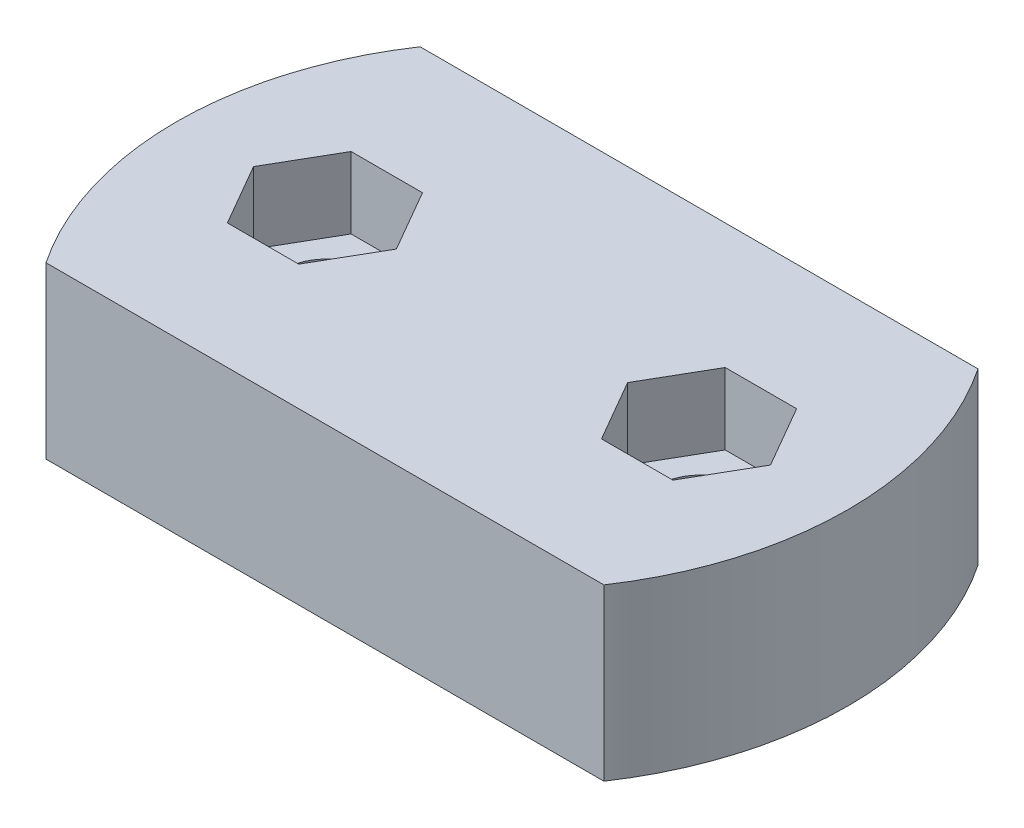
ISO-10303-21;
HEADER;
FILE_DESCRIPTION(('STEP AP214'),'2;1');
FILE_NAME('part.step','',(''),(''),'','','');
FILE_SCHEMA(('AUTOMOTIVE_DESIGN { 1 0 10303 214 1 1 1 1 }'));
ENDSEC;
DATA;
#1=APPLICATION_CONTEXT('core data for automotive mechanical design processes');
#2=APPLICATION_PROTOCOL_DEFINITION('international standard','automotive_design',2000,#1);
#3=PRODUCT_CONTEXT('',#1,'mechanical');
#4=PRODUCT('Part','Part','',(#3));
#5=PRODUCT_RELATED_PRODUCT_CATEGORY('part','',(#4));
#6=PRODUCT_DEFINITION_FORMATION('','',#4);
#7=PRODUCT_DEFINITION_CONTEXT('part definition',#1,'design');
#8=PRODUCT_DEFINITION('design','',#6,#7);
#9=PRODUCT_DEFINITION_SHAPE('','',#8);
#10=(LENGTH_UNIT() NAMED_UNIT(*) SI_UNIT(.MILLI.,.METRE.));
#11=(NAMED_UNIT(*) PLANE_ANGLE_UNIT() SI_UNIT($,.RADIAN.));
#12=(NAMED_UNIT(*) SI_UNIT($,.STERADIAN.) SOLID_ANGLE_UNIT());
#13=UNCERTAINTY_MEASURE_WITH_UNIT(LENGTH_MEASURE(1.E-05),#10,'distance_accuracy_value','');
#14=(GEOMETRIC_REPRESENTATION_CONTEXT(3) GLOBAL_UNCERTAINTY_ASSIGNED_CONTEXT((#13)) GLOBAL_UNIT_ASSIGNED_CONTEXT((#10,
#11,#12)) REPRESENTATION_CONTEXT('',''));
#15=CARTESIAN_POINT('',(0.,0.,0.));
#16=DIRECTION('',(0.,0.,1.));
#17=DIRECTION('',(1.,0.,0.));
#18=AXIS2_PLACEMENT_3D('',#15,#16,#17);
#19=CARTESIAN_POINT('',(0.,5.,0.));
#20=DIRECTION('',(0.,-1.,0.));
#21=DIRECTION('',(0.,0.,-1.));
#22=AXIS2_PLACEMENT_3D('',#19,#20,#21);
#23=CYLINDRICAL_SURFACE('',#22,19.75);
#24=CARTESIAN_POINT('',(0.,5.,0.));
#25=DIRECTION('',(0.,1.,0.));
#26=DIRECTION('',(0.,0.,1.));
#27=AXIS2_PLACEMENT_3D('',#24,#25,#26);
#28=CIRCLE('',#27,19.75);
#29=CARTESIAN_POINT('',(-16.4031247023242,5.,-11.));
#30=VERTEX_POINT('',#29);
#31=CARTESIAN_POINT('',(-16.4031247023242,5.,11.));
#32=VERTEX_POINT('',#31);
#33=EDGE_CURVE('E40',#30,#32,#28,.T.);
#34=ORIENTED_EDGE('',*,*,#33,.F.);
#35=DIRECTION('',(0.,1.,0.));
#36=VECTOR('',#35,1.);
#37=CARTESIAN_POINT('',(-16.4031247023242,-5.,-11.));
#38=LINE('',#37,#36);
#39=CARTESIAN_POINT('',(-16.4031247023242,-5.,-11.));
#40=VERTEX_POINT('',#39);
#41=EDGE_CURVE('E145',#40,#30,#38,.T.);
#42=ORIENTED_EDGE('',*,*,#41,.F.);
#43=CARTESIAN_POINT('',(0.,-5.,0.));
#44=DIRECTION('',(0.,1.,0.));
#45=DIRECTION('',(0.,0.,1.));
#46=AXIS2_PLACEMENT_3D('',#43,#44,#45);
#47=CIRCLE('',#46,19.75);
#48=CARTESIAN_POINT('',(-16.4031247023242,-5.,11.));
#49=VERTEX_POINT('',#48);
#50=EDGE_CURVE('E156',#40,#49,#47,.T.);
#51=ORIENTED_EDGE('',*,*,#50,.T.);
#52=DIRECTION('',(0.,1.,0.));
#53=VECTOR('',#52,1.);
#54=CARTESIAN_POINT('',(-16.4031247023242,-5.,11.));
#55=LINE('',#54,#53);
#56=EDGE_CURVE('E47',#49,#32,#55,.T.);
#57=ORIENTED_EDGE('',*,*,#56,.T.);
#58=EDGE_LOOP('',(#34,#42,#51,#57));
#59=FACE_BOUND('',#58,.T.);
#60=ADVANCED_FACE('F32',(#59),#23,.T.);
#61=CARTESIAN_POINT('',(16.4031247023242,-5.,11.));
#62=VERTEX_POINT('',#61);
#63=CARTESIAN_POINT('',(16.4031247023242,-5.,-11.));
#64=VERTEX_POINT('',#63);
#65=EDGE_CURVE('E35',#62,#64,#47,.T.);
#66=ORIENTED_EDGE('',*,*,#65,.T.);
#67=DIRECTION('',(0.,1.,0.));
#68=VECTOR('',#67,1.);
#69=CARTESIAN_POINT('',(16.4031247023242,-5.,-11.));
#70=LINE('',#69,#68);
#71=CARTESIAN_POINT('',(16.4031247023242,5.,-11.));
#72=VERTEX_POINT('',#71);
#73=EDGE_CURVE('E55',#64,#72,#70,.T.);
#74=ORIENTED_EDGE('',*,*,#73,.T.);
#75=CARTESIAN_POINT('',(16.4031247023242,5.,11.));
#76=VERTEX_POINT('',#75);
#77=EDGE_CURVE('E11',#76,#72,#28,.T.);
#78=ORIENTED_EDGE('',*,*,#77,.F.);
#79=DIRECTION('',(0.,1.,0.));
#80=VECTOR('',#79,1.);
#81=CARTESIAN_POINT('',(16.4031247023242,-5.,11.));
#82=LINE('',#81,#80);
#83=EDGE_CURVE('E281',#62,#76,#82,.T.);
#84=ORIENTED_EDGE('',*,*,#83,.F.);
#85=EDGE_LOOP('',(#66,#74,#78,#84));
#86=FACE_BOUND('',#85,.T.);
#87=ADVANCED_FACE('F268',(#86),#23,.T.);
#88=CARTESIAN_POINT('',(0.,5.,0.));
#89=DIRECTION('',(0.,1.,0.));
#90=DIRECTION('',(0.,0.,1.));
#91=AXIS2_PLACEMENT_3D('',#88,#89,#90);
#92=PLANE('',#91);
#93=DIRECTION('',(1.,0.,0.));
#94=VECTOR('',#93,1.);
#95=CARTESIAN_POINT('',(0.,5.,-11.));
#96=LINE('',#95,#94);
#97=EDGE_CURVE('E151',#30,#72,#96,.T.);
#98=ORIENTED_EDGE('',*,*,#97,.F.);
#99=ORIENTED_EDGE('',*,*,#33,.T.);
#100=DIRECTION('',(1.,0.,0.));
#101=VECTOR('',#100,1.);
#102=CARTESIAN_POINT('',(0.,5.,11.));
#103=LINE('',#102,#101);
#104=EDGE_CURVE('E287',#32,#76,#103,.T.);
#105=ORIENTED_EDGE('',*,*,#104,.T.);
#106=ORIENTED_EDGE('',*,*,#77,.T.);
#107=EDGE_LOOP('',(#98,#99,#105,#106));
#108=FACE_BOUND('',#107,.T.);
#109=DIRECTION('',(1.,0.,0.));
#110=VECTOR('',#109,1.);
#111=CARTESIAN_POINT('',(-13.1,5.,3.63730669589464));
#112=LINE('',#111,#110);
#113=CARTESIAN_POINT('',(-13.1,5.,3.63730669589464));
#114=VERTEX_POINT('',#113);
#115=CARTESIAN_POINT('',(-8.9,5.,3.63730669589464));
#116=VERTEX_POINT('',#115);
#117=EDGE_CURVE('E221',#114,#116,#112,.T.);
#118=ORIENTED_EDGE('',*,*,#117,.F.);
#119=DIRECTION('',(0.5,0.,0.866025403784438));
#120=VECTOR('',#119,1.);
#121=CARTESIAN_POINT('',(-15.2,5.,0.));
#122=LINE('',#121,#120);
#123=CARTESIAN_POINT('',(-15.2,5.,0.));
#124=VERTEX_POINT('',#123);
#125=EDGE_CURVE('E170',#124,#114,#122,.T.);
#126=ORIENTED_EDGE('',*,*,#125,.F.);
#127=DIRECTION('',(-0.5,0.,0.866025403784439));
#128=VECTOR('',#127,1.);
#129=CARTESIAN_POINT('',(-13.1,5.,-3.63730669589464));
#130=LINE('',#129,#128);
#131=CARTESIAN_POINT('',(-13.1,5.,-3.63730669589464));
#132=VERTEX_POINT('',#131);
#133=EDGE_CURVE('E327',#132,#124,#130,.T.);
#134=ORIENTED_EDGE('',*,*,#133,.F.);
#135=DIRECTION('',(-1.,0.,0.));
#136=VECTOR('',#135,1.);
#137=CARTESIAN_POINT('',(-8.9,5.,-3.63730669589464));
#138=LINE('',#137,#136);
#139=CARTESIAN_POINT('',(-8.9,5.,-3.63730669589464));
#140=VERTEX_POINT('',#139);
#141=EDGE_CURVE('E325',#140,#132,#138,.T.);
#142=ORIENTED_EDGE('',*,*,#141,.F.);
#143=DIRECTION('',(-0.5,0.,-0.866025403784438));
#144=VECTOR('',#143,1.);
#145=CARTESIAN_POINT('',(-6.8,5.,0.));
#146=LINE('',#145,#144);
#147=CARTESIAN_POINT('',(-6.8,5.,0.));
#148=VERTEX_POINT('',#147);
#149=EDGE_CURVE('E322',#148,#140,#146,.T.);
#150=ORIENTED_EDGE('',*,*,#149,.F.);
#151=DIRECTION('',(0.5,0.,-0.866025403784439));
#152=VECTOR('',#151,1.);
#153=CARTESIAN_POINT('',(-8.9,5.,3.63730669589464));
#154=LINE('',#153,#152);
#155=EDGE_CURVE('E319',#116,#148,#154,.T.);
#156=ORIENTED_EDGE('',*,*,#155,.F.);
#157=EDGE_LOOP('',(#118,#126,#134,#142,#150,#156));
#158=FACE_BOUND('',#157,.T.);
#159=DIRECTION('',(0.5,0.,-0.866025403784438));
#160=VECTOR('',#159,1.);
#161=CARTESIAN_POINT('',(15.2,5.,0.));
#162=LINE('',#161,#160);
#163=CARTESIAN_POINT('',(13.1,5.,3.63730669589464));
#164=VERTEX_POINT('',#163);
#165=CARTESIAN_POINT('',(15.2,5.,0.));
#166=VERTEX_POINT('',#165);
#167=EDGE_CURVE('E202',#164,#166,#162,.T.);
#168=ORIENTED_EDGE('',*,*,#167,.F.);
#169=DIRECTION('',(1.,0.,0.));
#170=VECTOR('',#169,1.);
#171=CARTESIAN_POINT('',(13.1,5.,3.63730669589464));
#172=LINE('',#171,#170);
#173=CARTESIAN_POINT('',(8.9,5.,3.63730669589464));
#174=VERTEX_POINT('',#173);
#175=EDGE_CURVE('E186',#174,#164,#172,.T.);
#176=ORIENTED_EDGE('',*,*,#175,.F.);
#177=DIRECTION('',(0.5,0.,0.866025403784439));
#178=VECTOR('',#177,1.);
#179=CARTESIAN_POINT('',(8.9,5.,3.63730669589464));
#180=LINE('',#179,#178);
#181=CARTESIAN_POINT('',(6.8,5.,0.));
#182=VERTEX_POINT('',#181);
#183=EDGE_CURVE('E214',#182,#174,#180,.T.);
#184=ORIENTED_EDGE('',*,*,#183,.F.);
#185=DIRECTION('',(-0.5,0.,0.866025403784438));
#186=VECTOR('',#185,1.);
#187=CARTESIAN_POINT('',(6.8,5.,0.));
#188=LINE('',#187,#186);
#189=CARTESIAN_POINT('',(8.9,5.,-3.63730669589464));
#190=VERTEX_POINT('',#189);
#191=EDGE_CURVE('E211',#190,#182,#188,.T.);
#192=ORIENTED_EDGE('',*,*,#191,.F.);
#193=DIRECTION('',(-1.,0.,0.));
#194=VECTOR('',#193,1.);
#195=CARTESIAN_POINT('',(8.9,5.,-3.63730669589464));
#196=LINE('',#195,#194);
#197=CARTESIAN_POINT('',(13.1,5.,-3.63730669589464));
#198=VERTEX_POINT('',#197);
#199=EDGE_CURVE('E208',#198,#190,#196,.T.);
#200=ORIENTED_EDGE('',*,*,#199,.F.);
#201=DIRECTION('',(-0.5,0.,-0.866025403784439));
#202=VECTOR('',#201,1.);
#203=CARTESIAN_POINT('',(13.1,5.,-3.63730669589464));
#204=LINE('',#203,#202);
#205=EDGE_CURVE('E204',#166,#198,#204,.T.);
#206=ORIENTED_EDGE('',*,*,#205,.F.);
#207=EDGE_LOOP('',(#168,#176,#184,#192,#200,#206));
#208=FACE_BOUND('',#207,.T.);
#209=ADVANCED_FACE('F240',(#108,#158,#208),#92,.T.);
#210=CARTESIAN_POINT('',(0.,-5.,0.));
#211=DIRECTION('',(0.,1.,0.));
#212=DIRECTION('',(0.,0.,1.));
#213=AXIS2_PLACEMENT_3D('',#210,#211,#212);
#214=PLANE('',#213);
#215=CARTESIAN_POINT('',(11.,-5.,0.));
#216=DIRECTION('',(0.,1.,0.));
#217=DIRECTION('',(0.,0.,1.));
#218=AXIS2_PLACEMENT_3D('',#215,#216,#217);
#219=CIRCLE('',#218,2.2479);
#220=CARTESIAN_POINT('',(11.,-5.,2.2479));
#221=VERTEX_POINT('',#220);
#222=EDGE_CURVE('E205',#221,#221,#219,.T.);
#223=ORIENTED_EDGE('',*,*,#222,.T.);
#224=EDGE_LOOP('',(#223));
#225=FACE_BOUND('',#224,.T.);
#226=CARTESIAN_POINT('',(-11.,-5.,0.));
#227=DIRECTION('',(0.,1.,0.));
#228=DIRECTION('',(0.,0.,1.));
#229=AXIS2_PLACEMENT_3D('',#226,#227,#228);
#230=CIRCLE('',#229,2.2479);
#231=CARTESIAN_POINT('',(-11.,-5.,2.2479));
#232=VERTEX_POINT('',#231);
#233=EDGE_CURVE('E293',#232,#232,#230,.T.);
#234=ORIENTED_EDGE('',*,*,#233,.T.);
#235=EDGE_LOOP('',(#234));
#236=FACE_BOUND('',#235,.T.);
#237=ORIENTED_EDGE('',*,*,#50,.F.);
#238=DIRECTION('',(1.,0.,0.));
#239=VECTOR('',#238,1.);
#240=CARTESIAN_POINT('',(0.,-5.,-11.));
#241=LINE('',#240,#239);
#242=EDGE_CURVE('E142',#40,#64,#241,.T.);
#243=ORIENTED_EDGE('',*,*,#242,.T.);
#244=ORIENTED_EDGE('',*,*,#65,.F.);
#245=DIRECTION('',(1.,0.,0.));
#246=VECTOR('',#245,1.);
#247=CARTESIAN_POINT('',(0.,-5.,11.));
#248=LINE('',#247,#246);
#249=EDGE_CURVE('E160',#49,#62,#248,.T.);
#250=ORIENTED_EDGE('',*,*,#249,.F.);
#251=EDGE_LOOP('',(#237,#243,#244,#250));
#252=FACE_BOUND('',#251,.T.);
#253=ADVANCED_FACE('F159',(#225,#236,#252),#214,.F.);
#254=CARTESIAN_POINT('',(15.2,0.799999999999999,0.));
#255=DIRECTION('',(0.866025403784438,0.,0.5));
#256=DIRECTION('',(0.5,0.,-0.866025403784438));
#257=AXIS2_PLACEMENT_3D('',#254,#255,#256);
#258=PLANE('',#257);
#259=ORIENTED_EDGE('',*,*,#167,.T.);
#260=DIRECTION('',(0.,1.,0.));
#261=VECTOR('',#260,1.);
#262=CARTESIAN_POINT('',(15.2,0.799999999999999,0.));
#263=LINE('',#262,#261);
#264=CARTESIAN_POINT('',(15.2,0.799999999999999,0.));
#265=VERTEX_POINT('',#264);
#266=EDGE_CURVE('E201',#265,#166,#263,.T.);
#267=ORIENTED_EDGE('',*,*,#266,.F.);
#268=DIRECTION('',(0.5,0.,-0.866025403784438));
#269=VECTOR('',#268,1.);
#270=CARTESIAN_POINT('',(15.2,0.799999999999999,0.));
#271=LINE('',#270,#269);
#272=CARTESIAN_POINT('',(13.1,0.799999999999999,3.63730669589464));
#273=VERTEX_POINT('',#272);
#274=EDGE_CURVE('E182',#273,#265,#271,.T.);
#275=ORIENTED_EDGE('',*,*,#274,.F.);
#276=DIRECTION('',(0.,1.,0.));
#277=VECTOR('',#276,1.);
#278=CARTESIAN_POINT('',(13.1,0.799999999999999,3.63730669589464));
#279=LINE('',#278,#277);
#280=EDGE_CURVE('E219',#273,#164,#279,.T.);
#281=ORIENTED_EDGE('',*,*,#280,.T.);
#282=EDGE_LOOP('',(#259,#267,#275,#281));
#283=FACE_BOUND('',#282,.T.);
#284=ADVANCED_FACE('F251',(#283),#258,.F.);
#285=CARTESIAN_POINT('',(13.1,0.799999999999999,3.63730669589464));
#286=DIRECTION('',(0.,0.,1.));
#287=DIRECTION('',(1.,0.,0.));
#288=AXIS2_PLACEMENT_3D('',#285,#286,#287);
#289=PLANE('',#288);
#290=ORIENTED_EDGE('',*,*,#175,.T.);
#291=ORIENTED_EDGE('',*,*,#280,.F.);
#292=DIRECTION('',(1.,0.,0.));
#293=VECTOR('',#292,1.);
#294=CARTESIAN_POINT('',(13.1,0.799999999999999,3.63730669589464));
#295=LINE('',#294,#293);
#296=CARTESIAN_POINT('',(8.9,0.799999999999999,3.63730669589464));
#297=VERTEX_POINT('',#296);
#298=EDGE_CURVE('E198',#297,#273,#295,.T.);
#299=ORIENTED_EDGE('',*,*,#298,.F.);
#300=DIRECTION('',(0.,1.,0.));
#301=VECTOR('',#300,1.);
#302=CARTESIAN_POINT('',(8.9,0.799999999999999,3.63730669589464));
#303=LINE('',#302,#301);
#304=EDGE_CURVE('E222',#297,#174,#303,.T.);
#305=ORIENTED_EDGE('',*,*,#304,.T.);
#306=EDGE_LOOP('',(#290,#291,#299,#305));
#307=FACE_BOUND('',#306,.T.);
#308=ADVANCED_FACE('F253',(#307),#289,.F.);
#309=CARTESIAN_POINT('',(8.9,0.799999999999999,3.63730669589464));
#310=DIRECTION('',(-0.866025403784439,0.,0.5));
#311=DIRECTION('',(0.5,0.,0.866025403784439));
#312=AXIS2_PLACEMENT_3D('',#309,#310,#311);
#313=PLANE('',#312);
#314=ORIENTED_EDGE('',*,*,#183,.T.);
#315=ORIENTED_EDGE('',*,*,#304,.F.);
#316=DIRECTION('',(0.5,0.,0.866025403784439));
#317=VECTOR('',#316,1.);
#318=CARTESIAN_POINT('',(8.9,0.799999999999999,3.63730669589464));
#319=LINE('',#318,#317);
#320=CARTESIAN_POINT('',(6.8,0.799999999999999,0.));
#321=VERTEX_POINT('',#320);
#322=EDGE_CURVE('E195',#321,#297,#319,.T.);
#323=ORIENTED_EDGE('',*,*,#322,.F.);
#324=DIRECTION('',(0.,1.,0.));
#325=VECTOR('',#324,1.);
#326=CARTESIAN_POINT('',(6.8,0.799999999999999,0.));
#327=LINE('',#326,#325);
#328=EDGE_CURVE('E224',#321,#182,#327,.T.);
#329=ORIENTED_EDGE('',*,*,#328,.T.);
#330=EDGE_LOOP('',(#314,#315,#323,#329));
#331=FACE_BOUND('',#330,.T.);
#332=ADVANCED_FACE('F255',(#331),#313,.F.);
#333=CARTESIAN_POINT('',(6.8,0.799999999999999,0.));
#334=DIRECTION('',(-0.866025403784439,0.,-0.5));
#335=DIRECTION('',(-0.5,0.,0.866025403784439));
#336=AXIS2_PLACEMENT_3D('',#333,#334,#335);
#337=PLANE('',#336);
#338=ORIENTED_EDGE('',*,*,#191,.T.);
#339=ORIENTED_EDGE('',*,*,#328,.F.);
#340=DIRECTION('',(-0.5,0.,0.866025403784438));
#341=VECTOR('',#340,1.);
#342=CARTESIAN_POINT('',(6.8,0.799999999999999,0.));
#343=LINE('',#342,#341);
#344=CARTESIAN_POINT('',(8.9,0.799999999999999,-3.63730669589464));
#345=VERTEX_POINT('',#344);
#346=EDGE_CURVE('E192',#345,#321,#343,.T.);
#347=ORIENTED_EDGE('',*,*,#346,.F.);
#348=DIRECTION('',(0.,1.,0.));
#349=VECTOR('',#348,1.);
#350=CARTESIAN_POINT('',(8.9,0.799999999999999,-3.63730669589464));
#351=LINE('',#350,#349);
#352=EDGE_CURVE('E226',#345,#190,#351,.T.);
#353=ORIENTED_EDGE('',*,*,#352,.T.);
#354=EDGE_LOOP('',(#338,#339,#347,#353));
#355=FACE_BOUND('',#354,.T.);
#356=ADVANCED_FACE('F258',(#355),#337,.F.);
#357=CARTESIAN_POINT('',(8.9,0.799999999999999,-3.63730669589464));
#358=DIRECTION('',(0.,0.,-1.));
#359=DIRECTION('',(-1.,0.,0.));
#360=AXIS2_PLACEMENT_3D('',#357,#358,#359);
#361=PLANE('',#360);
#362=ORIENTED_EDGE('',*,*,#199,.T.);
#363=ORIENTED_EDGE('',*,*,#352,.F.);
#364=DIRECTION('',(-1.,0.,0.));
#365=VECTOR('',#364,1.);
#366=CARTESIAN_POINT('',(8.9,0.799999999999999,-3.63730669589464));
#367=LINE('',#366,#365);
#368=CARTESIAN_POINT('',(13.1,0.799999999999999,-3.63730669589464));
#369=VERTEX_POINT('',#368);
#370=EDGE_CURVE('E189',#369,#345,#367,.T.);
#371=ORIENTED_EDGE('',*,*,#370,.F.);
#372=DIRECTION('',(0.,1.,0.));
#373=VECTOR('',#372,1.);
#374=CARTESIAN_POINT('',(13.1,0.799999999999999,-3.63730669589464));
#375=LINE('',#374,#373);
#376=EDGE_CURVE('E228',#369,#198,#375,.T.);
#377=ORIENTED_EDGE('',*,*,#376,.T.);
#378=EDGE_LOOP('',(#362,#363,#371,#377));
#379=FACE_BOUND('',#378,.T.);
#380=ADVANCED_FACE('F245',(#379),#361,.F.);
#381=CARTESIAN_POINT('',(13.1,0.799999999999999,-3.63730669589464));
#382=DIRECTION('',(0.866025403784439,0.,-0.5));
#383=DIRECTION('',(-0.5,0.,-0.866025403784439));
#384=AXIS2_PLACEMENT_3D('',#381,#382,#383);
#385=PLANE('',#384);
#386=ORIENTED_EDGE('',*,*,#205,.T.);
#387=ORIENTED_EDGE('',*,*,#376,.F.);
#388=DIRECTION('',(-0.5,0.,-0.866025403784439));
#389=VECTOR('',#388,1.);
#390=CARTESIAN_POINT('',(13.1,0.799999999999999,-3.63730669589464));
#391=LINE('',#390,#389);
#392=EDGE_CURVE('E185',#265,#369,#391,.T.);
#393=ORIENTED_EDGE('',*,*,#392,.F.);
#394=ORIENTED_EDGE('',*,*,#266,.T.);
#395=EDGE_LOOP('',(#386,#387,#393,#394));
#396=FACE_BOUND('',#395,.T.);
#397=ADVANCED_FACE('F234',(#396),#385,.F.);
#398=CARTESIAN_POINT('',(0.,0.799999999999999,0.));
#399=DIRECTION('',(0.,-1.,0.));
#400=DIRECTION('',(0.,0.,-1.));
#401=AXIS2_PLACEMENT_3D('',#398,#399,#400);
#402=PLANE('',#401);
#403=CARTESIAN_POINT('',(11.,0.8,0.));
#404=DIRECTION('',(0.,1.,0.));
#405=DIRECTION('',(0.,0.,1.));
#406=AXIS2_PLACEMENT_3D('',#403,#404,#405);
#407=CIRCLE('',#406,2.2479);
#408=CARTESIAN_POINT('',(11.,0.8,2.2479));
#409=VERTEX_POINT('',#408);
#410=EDGE_CURVE('E296',#409,#409,#407,.T.);
#411=ORIENTED_EDGE('',*,*,#410,.F.);
#412=EDGE_LOOP('',(#411));
#413=FACE_BOUND('',#412,.T.);
#414=ORIENTED_EDGE('',*,*,#274,.T.);
#415=ORIENTED_EDGE('',*,*,#392,.T.);
#416=ORIENTED_EDGE('',*,*,#370,.T.);
#417=ORIENTED_EDGE('',*,*,#346,.T.);
#418=ORIENTED_EDGE('',*,*,#322,.T.);
#419=ORIENTED_EDGE('',*,*,#298,.T.);
#420=EDGE_LOOP('',(#414,#415,#416,#417,#418,#419));
#421=FACE_BOUND('',#420,.T.);
#422=ADVANCED_FACE('F249',(#413,#421),#402,.F.);
#423=CARTESIAN_POINT('',(-13.1,0.799999999999999,3.63730669589464));
#424=DIRECTION('',(0.,0.,1.));
#425=DIRECTION('',(1.,0.,0.));
#426=AXIS2_PLACEMENT_3D('',#423,#424,#425);
#427=PLANE('',#426);
#428=ORIENTED_EDGE('',*,*,#117,.T.);
#429=DIRECTION('',(0.,1.,0.));
#430=VECTOR('',#429,1.);
#431=CARTESIAN_POINT('',(-8.9,0.799999999999999,3.63730669589464));
#432=LINE('',#431,#430);
#433=CARTESIAN_POINT('',(-8.9,0.799999999999999,3.63730669589464));
#434=VERTEX_POINT('',#433);
#435=EDGE_CURVE('E178',#434,#116,#432,.T.);
#436=ORIENTED_EDGE('',*,*,#435,.F.);
#437=DIRECTION('',(1.,0.,0.));
#438=VECTOR('',#437,1.);
#439=CARTESIAN_POINT('',(-13.1,0.799999999999999,3.63730669589464));
#440=LINE('',#439,#438);
#441=CARTESIAN_POINT('',(-13.1,0.799999999999999,3.63730669589464));
#442=VERTEX_POINT('',#441);
#443=EDGE_CURVE('E301',#442,#434,#440,.T.);
#444=ORIENTED_EDGE('',*,*,#443,.F.);
#445=DIRECTION('',(0.,1.,0.));
#446=VECTOR('',#445,1.);
#447=CARTESIAN_POINT('',(-13.1,0.799999999999999,3.63730669589464));
#448=LINE('',#447,#446);
#449=EDGE_CURVE('E161',#442,#114,#448,.T.);
#450=ORIENTED_EDGE('',*,*,#449,.T.);
#451=EDGE_LOOP('',(#428,#436,#444,#450));
#452=FACE_BOUND('',#451,.T.);
#453=ADVANCED_FACE('F339',(#452),#427,.F.);
#454=CARTESIAN_POINT('',(-15.2,0.799999999999999,0.));
#455=DIRECTION('',(-0.866025403784438,0.,0.5));
#456=DIRECTION('',(0.5,0.,0.866025403784438));
#457=AXIS2_PLACEMENT_3D('',#454,#455,#456);
#458=PLANE('',#457);
#459=ORIENTED_EDGE('',*,*,#125,.T.);
#460=ORIENTED_EDGE('',*,*,#449,.F.);
#461=DIRECTION('',(0.5,0.,0.866025403784438));
#462=VECTOR('',#461,1.);
#463=CARTESIAN_POINT('',(-15.2,0.799999999999999,0.));
#464=LINE('',#463,#462);
#465=CARTESIAN_POINT('',(-15.2,0.799999999999999,0.));
#466=VERTEX_POINT('',#465);
#467=EDGE_CURVE('E181',#466,#442,#464,.T.);
#468=ORIENTED_EDGE('',*,*,#467,.F.);
#469=DIRECTION('',(0.,1.,0.));
#470=VECTOR('',#469,1.);
#471=CARTESIAN_POINT('',(-15.2,0.799999999999999,0.));
#472=LINE('',#471,#470);
#473=EDGE_CURVE('E162',#466,#124,#472,.T.);
#474=ORIENTED_EDGE('',*,*,#473,.T.);
#475=EDGE_LOOP('',(#459,#460,#468,#474));
#476=FACE_BOUND('',#475,.T.);
#477=ADVANCED_FACE('F334',(#476),#458,.F.);
#478=CARTESIAN_POINT('',(-13.1,0.799999999999999,-3.63730669589464));
#479=DIRECTION('',(-0.866025403784439,0.,-0.5));
#480=DIRECTION('',(-0.5,0.,0.866025403784439));
#481=AXIS2_PLACEMENT_3D('',#478,#479,#480);
#482=PLANE('',#481);
#483=ORIENTED_EDGE('',*,*,#133,.T.);
#484=ORIENTED_EDGE('',*,*,#473,.F.);
#485=DIRECTION('',(-0.5,0.,0.866025403784439));
#486=VECTOR('',#485,1.);
#487=CARTESIAN_POINT('',(-13.1,0.799999999999999,-3.63730669589464));
#488=LINE('',#487,#486);
#489=CARTESIAN_POINT('',(-13.1,0.799999999999999,-3.63730669589464));
#490=VERTEX_POINT('',#489);
#491=EDGE_CURVE('E313',#490,#466,#488,.T.);
#492=ORIENTED_EDGE('',*,*,#491,.F.);
#493=DIRECTION('',(0.,1.,0.));
#494=VECTOR('',#493,1.);
#495=CARTESIAN_POINT('',(-13.1,0.799999999999999,-3.63730669589464));
#496=LINE('',#495,#494);
#497=EDGE_CURVE('E167',#490,#132,#496,.T.);
#498=ORIENTED_EDGE('',*,*,#497,.T.);
#499=EDGE_LOOP('',(#483,#484,#492,#498));
#500=FACE_BOUND('',#499,.T.);
#501=ADVANCED_FACE('F348',(#500),#482,.F.);
#502=CARTESIAN_POINT('',(-8.9,0.799999999999999,-3.63730669589464));
#503=DIRECTION('',(0.,0.,-1.));
#504=DIRECTION('',(-1.,0.,0.));
#505=AXIS2_PLACEMENT_3D('',#502,#503,#504);
#506=PLANE('',#505);
#507=ORIENTED_EDGE('',*,*,#141,.T.);
#508=ORIENTED_EDGE('',*,*,#497,.F.);
#509=DIRECTION('',(-1.,0.,0.));
#510=VECTOR('',#509,1.);
#511=CARTESIAN_POINT('',(-8.9,0.799999999999999,-3.63730669589464));
#512=LINE('',#511,#510);
#513=CARTESIAN_POINT('',(-8.9,0.799999999999999,-3.63730669589464));
#514=VERTEX_POINT('',#513);
#515=EDGE_CURVE('E310',#514,#490,#512,.T.);
#516=ORIENTED_EDGE('',*,*,#515,.F.);
#517=DIRECTION('',(0.,1.,0.));
#518=VECTOR('',#517,1.);
#519=CARTESIAN_POINT('',(-8.9,0.799999999999999,-3.63730669589464));
#520=LINE('',#519,#518);
#521=EDGE_CURVE('E174',#514,#140,#520,.T.);
#522=ORIENTED_EDGE('',*,*,#521,.T.);
#523=EDGE_LOOP('',(#507,#508,#516,#522));
#524=FACE_BOUND('',#523,.T.);
#525=ADVANCED_FACE('F351',(#524),#506,.F.);
#526=CARTESIAN_POINT('',(-6.8,0.799999999999999,0.));
#527=DIRECTION('',(0.866025403784439,0.,-0.5));
#528=DIRECTION('',(-0.5,0.,-0.866025403784439));
#529=AXIS2_PLACEMENT_3D('',#526,#527,#528);
#530=PLANE('',#529);
#531=ORIENTED_EDGE('',*,*,#149,.T.);
#532=ORIENTED_EDGE('',*,*,#521,.F.);
#533=DIRECTION('',(-0.5,0.,-0.866025403784438));
#534=VECTOR('',#533,1.);
#535=CARTESIAN_POINT('',(-6.8,0.799999999999999,0.));
#536=LINE('',#535,#534);
#537=CARTESIAN_POINT('',(-6.8,0.799999999999999,0.));
#538=VERTEX_POINT('',#537);
#539=EDGE_CURVE('E307',#538,#514,#536,.T.);
#540=ORIENTED_EDGE('',*,*,#539,.F.);
#541=DIRECTION('',(0.,1.,0.));
#542=VECTOR('',#541,1.);
#543=CARTESIAN_POINT('',(-6.8,0.799999999999999,0.));
#544=LINE('',#543,#542);
#545=EDGE_CURVE('E176',#538,#148,#544,.T.);
#546=ORIENTED_EDGE('',*,*,#545,.T.);
#547=EDGE_LOOP('',(#531,#532,#540,#546));
#548=FACE_BOUND('',#547,.T.);
#549=ADVANCED_FACE('F353',(#548),#530,.F.);
#550=CARTESIAN_POINT('',(-8.9,0.799999999999999,3.63730669589464));
#551=DIRECTION('',(0.866025403784439,0.,0.5));
#552=DIRECTION('',(0.5,0.,-0.866025403784439));
#553=AXIS2_PLACEMENT_3D('',#550,#551,#552);
#554=PLANE('',#553);
#555=ORIENTED_EDGE('',*,*,#155,.T.);
#556=ORIENTED_EDGE('',*,*,#545,.F.);
#557=DIRECTION('',(0.5,0.,-0.866025403784439));
#558=VECTOR('',#557,1.);
#559=CARTESIAN_POINT('',(-8.9,0.799999999999999,3.63730669589464));
#560=LINE('',#559,#558);
#561=EDGE_CURVE('E304',#434,#538,#560,.T.);
#562=ORIENTED_EDGE('',*,*,#561,.F.);
#563=ORIENTED_EDGE('',*,*,#435,.T.);
#564=EDGE_LOOP('',(#555,#556,#562,#563));
#565=FACE_BOUND('',#564,.T.);
#566=ADVANCED_FACE('F342',(#565),#554,.F.);
#567=CARTESIAN_POINT('',(0.,0.799999999999999,0.));
#568=DIRECTION('',(0.,1.,0.));
#569=DIRECTION('',(0.,0.,1.));
#570=AXIS2_PLACEMENT_3D('',#567,#568,#569);
#571=PLANE('',#570);
#572=CARTESIAN_POINT('',(-11.,0.8,0.));
#573=DIRECTION('',(0.,1.,0.));
#574=DIRECTION('',(0.,0.,1.));
#575=AXIS2_PLACEMENT_3D('',#572,#573,#574);
#576=CIRCLE('',#575,2.2479);
#577=CARTESIAN_POINT('',(-11.,0.8,2.2479));
#578=VERTEX_POINT('',#577);
#579=EDGE_CURVE('E290',#578,#578,#576,.T.);
#580=ORIENTED_EDGE('',*,*,#579,.F.);
#581=EDGE_LOOP('',(#580));
#582=FACE_BOUND('',#581,.T.);
#583=ORIENTED_EDGE('',*,*,#443,.T.);
#584=ORIENTED_EDGE('',*,*,#561,.T.);
#585=ORIENTED_EDGE('',*,*,#539,.T.);
#586=ORIENTED_EDGE('',*,*,#515,.T.);
#587=ORIENTED_EDGE('',*,*,#491,.T.);
#588=ORIENTED_EDGE('',*,*,#467,.T.);
#589=EDGE_LOOP('',(#583,#584,#585,#586,#587,#588));
#590=FACE_BOUND('',#589,.T.);
#591=ADVANCED_FACE('F345',(#582,#590),#571,.T.);
#592=CARTESIAN_POINT('',(11.,0.799999999999999,0.));
#593=DIRECTION('',(0.,1.,0.));
#594=DIRECTION('',(0.,0.,1.));
#595=AXIS2_PLACEMENT_3D('',#592,#593,#594);
#596=CYLINDRICAL_SURFACE('',#595,2.2479);
#597=ORIENTED_EDGE('',*,*,#222,.F.);
#598=EDGE_LOOP('',(#597));
#599=FACE_BOUND('',#598,.T.);
#600=ORIENTED_EDGE('',*,*,#410,.T.);
#601=EDGE_LOOP('',(#600));
#602=FACE_BOUND('',#601,.T.);
#603=ADVANCED_FACE('F426',(#599,#602),#596,.F.);
#604=CARTESIAN_POINT('',(-11.,0.799999999999999,0.));
#605=DIRECTION('',(0.,1.,0.));
#606=DIRECTION('',(0.,0.,1.));
#607=AXIS2_PLACEMENT_3D('',#604,#605,#606);
#608=CYLINDRICAL_SURFACE('',#607,2.2479);
#609=ORIENTED_EDGE('',*,*,#233,.F.);
#610=EDGE_LOOP('',(#609));
#611=FACE_BOUND('',#610,.T.);
#612=ORIENTED_EDGE('',*,*,#579,.T.);
#613=EDGE_LOOP('',(#612));
#614=FACE_BOUND('',#613,.T.);
#615=ADVANCED_FACE('F433',(#611,#614),#608,.F.);
#616=CARTESIAN_POINT('',(0.,-5.,11.));
#617=DIRECTION('',(0.,0.,1.));
#618=DIRECTION('',(1.,0.,0.));
#619=AXIS2_PLACEMENT_3D('',#616,#617,#618);
#620=PLANE('',#619);
#621=ORIENTED_EDGE('',*,*,#104,.F.);
#622=ORIENTED_EDGE('',*,*,#56,.F.);
#623=ORIENTED_EDGE('',*,*,#249,.T.);
#624=ORIENTED_EDGE('',*,*,#83,.T.);
#625=EDGE_LOOP('',(#621,#622,#623,#624));
#626=FACE_BOUND('',#625,.T.);
#627=ADVANCED_FACE('F440',(#626),#620,.T.);
#628=CARTESIAN_POINT('',(0.,-5.,-11.));
#629=DIRECTION('',(0.,0.,1.));
#630=DIRECTION('',(1.,0.,0.));
#631=AXIS2_PLACEMENT_3D('',#628,#629,#630);
#632=PLANE('',#631);
#633=ORIENTED_EDGE('',*,*,#97,.T.);
#634=ORIENTED_EDGE('',*,*,#73,.F.);
#635=ORIENTED_EDGE('',*,*,#242,.F.);
#636=ORIENTED_EDGE('',*,*,#41,.T.);
#637=EDGE_LOOP('',(#633,#634,#635,#636));
#638=FACE_BOUND('',#637,.T.);
#639=ADVANCED_FACE('F144',(#638),#632,.F.);
#640=CLOSED_SHELL('',(#60,#87,#209,#253,#284,#308,#332,#356,#380,#397,#422,#453,#477,#501,#525,
#549,#566,#591,#603,#615,#627,#639));
#641=MANIFOLD_SOLID_BREP('B2',#640);
#642=ADVANCED_BREP_SHAPE_REPRESENTATION('',(#18,#641),#14);
#643=SHAPE_DEFINITION_REPRESENTATION(#9,#642);
ENDSEC;
END-ISO-10303-21;
